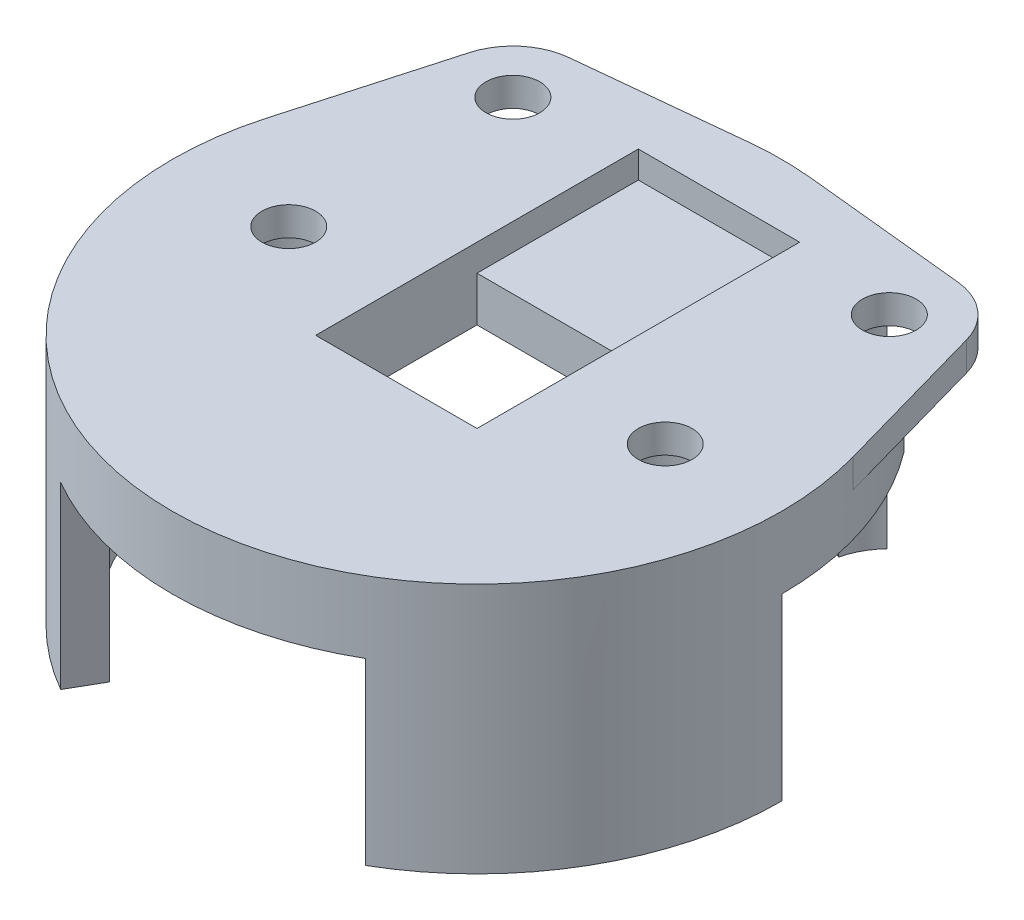
ISO-10303-21;
HEADER;
FILE_DESCRIPTION(('STEP AP214'),'2;1');
FILE_NAME('part.step','',(''),(''),'','','');
FILE_SCHEMA(('AUTOMOTIVE_DESIGN { 1 0 10303 214 1 1 1 1 }'));
ENDSEC;
DATA;
#1=APPLICATION_CONTEXT('core data for automotive mechanical design processes');
#2=APPLICATION_PROTOCOL_DEFINITION('international standard','automotive_design',2000,#1);
#3=PRODUCT_CONTEXT('',#1,'mechanical');
#4=PRODUCT('Part','Part','',(#3));
#5=PRODUCT_RELATED_PRODUCT_CATEGORY('part','',(#4));
#6=PRODUCT_DEFINITION_FORMATION('','',#4);
#7=PRODUCT_DEFINITION_CONTEXT('part definition',#1,'design');
#8=PRODUCT_DEFINITION('design','',#6,#7);
#9=PRODUCT_DEFINITION_SHAPE('','',#8);
#10=(LENGTH_UNIT() NAMED_UNIT(*) SI_UNIT(.MILLI.,.METRE.));
#11=(NAMED_UNIT(*) PLANE_ANGLE_UNIT() SI_UNIT($,.RADIAN.));
#12=(NAMED_UNIT(*) SI_UNIT($,.STERADIAN.) SOLID_ANGLE_UNIT());
#13=UNCERTAINTY_MEASURE_WITH_UNIT(LENGTH_MEASURE(1.E-05),#10,'distance_accuracy_value','');
#14=(GEOMETRIC_REPRESENTATION_CONTEXT(3) GLOBAL_UNCERTAINTY_ASSIGNED_CONTEXT((#13)) GLOBAL_UNIT_ASSIGNED_CONTEXT((#10,
#11,#12)) REPRESENTATION_CONTEXT('',''));
#15=CARTESIAN_POINT('',(0.,0.,0.));
#16=DIRECTION('',(0.,0.,1.));
#17=DIRECTION('',(1.,0.,0.));
#18=AXIS2_PLACEMENT_3D('',#15,#16,#17);
#19=CARTESIAN_POINT('',(0.,-10.,0.));
#20=DIRECTION('',(0.,1.,0.));
#21=DIRECTION('',(0.,0.,1.));
#22=AXIS2_PLACEMENT_3D('',#19,#20,#21);
#23=CYLINDRICAL_SURFACE('',#22,17.);
#24=CARTESIAN_POINT('',(0.,-10.,0.));
#25=DIRECTION('',(0.,1.,0.));
#26=DIRECTION('',(0.,0.,1.));
#27=AXIS2_PLACEMENT_3D('',#24,#25,#26);
#28=CIRCLE('',#27,17.);
#29=CARTESIAN_POINT('',(7.75524838483941,-10.,-15.1279913567349));
#30=VERTEX_POINT('',#29);
#31=CARTESIAN_POINT('',(-7.75524838483941,-10.,-15.1279913567349));
#32=VERTEX_POINT('',#31);
#33=EDGE_CURVE('E344',#30,#32,#28,.T.);
#34=ORIENTED_EDGE('',*,*,#33,.T.);
#35=DIRECTION('',(0.,1.,0.));
#36=VECTOR('',#35,1.);
#37=CARTESIAN_POINT('',(-7.75524838483941,-10.,-15.1279913567349));
#38=LINE('',#37,#36);
#39=CARTESIAN_POINT('',(-7.75524838483941,2.4,-15.1279913567349));
#40=VERTEX_POINT('',#39);
#41=EDGE_CURVE('E529',#32,#40,#38,.T.);
#42=ORIENTED_EDGE('',*,*,#41,.T.);
#43=CARTESIAN_POINT('',(0.,2.4,0.));
#44=DIRECTION('',(0.,-1.,0.));
#45=DIRECTION('',(0.,0.,-1.));
#46=AXIS2_PLACEMENT_3D('',#43,#44,#45);
#47=CIRCLE('',#46,17.);
#48=CARTESIAN_POINT('',(-1.72329934892919,2.4,-16.9124285468995));
#49=VERTEX_POINT('',#48);
#50=EDGE_CURVE('E513',#49,#40,#47,.F.);
#51=ORIENTED_EDGE('',*,*,#50,.F.);
#52=DIRECTION('',(0.,-1.,0.));
#53=VECTOR('',#52,1.);
#54=CARTESIAN_POINT('',(-1.7232993489292,4.,-16.9124285468995));
#55=LINE('',#54,#53);
#56=CARTESIAN_POINT('',(-1.7232993489292,4.,-16.9124285468995));
#57=VERTEX_POINT('',#56);
#58=EDGE_CURVE('E311',#57,#49,#55,.T.);
#59=ORIENTED_EDGE('',*,*,#58,.F.);
#60=CARTESIAN_POINT('',(0.,4.,0.));
#61=DIRECTION('',(0.,1.,0.));
#62=DIRECTION('',(0.,0.,1.));
#63=AXIS2_PLACEMENT_3D('',#60,#61,#62);
#64=CIRCLE('',#63,17.);
#65=CARTESIAN_POINT('',(1.7232993489292,4.,-16.9124285468995));
#66=VERTEX_POINT('',#65);
#67=EDGE_CURVE('E301',#66,#57,#64,.T.);
#68=ORIENTED_EDGE('',*,*,#67,.F.);
#69=DIRECTION('',(0.,-1.,0.));
#70=VECTOR('',#69,1.);
#71=CARTESIAN_POINT('',(1.7232993489292,4.,-16.9124285468995));
#72=LINE('',#71,#70);
#73=CARTESIAN_POINT('',(1.7232993489292,2.4,-16.9124285468995));
#74=VERTEX_POINT('',#73);
#75=EDGE_CURVE('E317',#66,#74,#72,.T.);
#76=ORIENTED_EDGE('',*,*,#75,.T.);
#77=CARTESIAN_POINT('',(0.,2.4,0.));
#78=DIRECTION('',(0.,-1.,0.));
#79=DIRECTION('',(0.,0.,-1.));
#80=AXIS2_PLACEMENT_3D('',#77,#78,#79);
#81=CIRCLE('',#80,17.);
#82=CARTESIAN_POINT('',(7.75524838483941,2.4,-15.1279913567349));
#83=VERTEX_POINT('',#82);
#84=EDGE_CURVE('E62',#83,#74,#81,.F.);
#85=ORIENTED_EDGE('',*,*,#84,.F.);
#86=DIRECTION('',(0.,1.,0.));
#87=VECTOR('',#86,1.);
#88=CARTESIAN_POINT('',(7.75524838483941,-10.,-15.1279913567349));
#89=LINE('',#88,#87);
#90=EDGE_CURVE('E397',#30,#83,#89,.T.);
#91=ORIENTED_EDGE('',*,*,#90,.F.);
#92=EDGE_LOOP('',(#34,#42,#51,#59,#68,#76,#85,#91));
#93=FACE_BOUND('',#92,.T.);
#94=ADVANCED_FACE('F39',(#93),#23,.T.);
#95=CARTESIAN_POINT('',(0.,-10.,0.));
#96=DIRECTION('',(0.,1.,0.));
#97=DIRECTION('',(0.,0.,1.));
#98=AXIS2_PLACEMENT_3D('',#95,#96,#97);
#99=PLANE('',#98);
#100=CARTESIAN_POINT('',(-10.5,-10.,-12.5));
#101=DIRECTION('',(0.,-1.,0.));
#102=DIRECTION('',(0.,0.,-1.));
#103=AXIS2_PLACEMENT_3D('',#100,#101,#102);
#104=CIRCLE('',#103,3.8);
#105=CARTESIAN_POINT('',(-6.80085727604426,-10.,-13.3696798881228));
#106=VERTEX_POINT('',#105);
#107=EDGE_CURVE('E523',#32,#106,#104,.T.);
#108=ORIENTED_EDGE('',*,*,#107,.F.);
#109=ORIENTED_EDGE('',*,*,#33,.F.);
#110=CARTESIAN_POINT('',(10.5,-10.,-12.5));
#111=DIRECTION('',(0.,-1.,0.));
#112=DIRECTION('',(0.,0.,-1.));
#113=AXIS2_PLACEMENT_3D('',#110,#111,#112);
#114=CIRCLE('',#113,3.8);
#115=CARTESIAN_POINT('',(6.80085727604426,-10.,-13.3696798881228));
#116=VERTEX_POINT('',#115);
#117=EDGE_CURVE('E384',#116,#30,#114,.T.);
#118=ORIENTED_EDGE('',*,*,#117,.F.);
#119=CARTESIAN_POINT('',(0.,-10.,0.));
#120=DIRECTION('',(0.,1.,0.));
#121=DIRECTION('',(0.,0.,1.));
#122=AXIS2_PLACEMENT_3D('',#119,#120,#121);
#123=CIRCLE('',#122,15.);
#124=EDGE_CURVE('E333',#116,#106,#123,.T.);
#125=ORIENTED_EDGE('',*,*,#124,.T.);
#126=EDGE_LOOP('',(#108,#109,#118,#125));
#127=FACE_BOUND('',#126,.T.);
#128=ADVANCED_FACE('F395',(#127),#99,.F.);
#129=CARTESIAN_POINT('',(0.,-10.,0.));
#130=DIRECTION('',(0.,1.,0.));
#131=DIRECTION('',(0.,0.,1.));
#132=AXIS2_PLACEMENT_3D('',#129,#130,#131);
#133=CYLINDRICAL_SURFACE('',#132,15.);
#134=DIRECTION('',(0.,1.,0.));
#135=VECTOR('',#134,1.);
#136=CARTESIAN_POINT('',(-6.80085727604426,-5.,-13.3696798881228));
#137=LINE('',#136,#135);
#138=CARTESIAN_POINT('',(-6.80085727604425,0.,-13.3696798881228));
#139=VERTEX_POINT('',#138);
#140=EDGE_CURVE('E402',#106,#139,#137,.T.);
#141=ORIENTED_EDGE('',*,*,#140,.F.);
#142=ORIENTED_EDGE('',*,*,#124,.F.);
#143=DIRECTION('',(0.,1.,0.));
#144=VECTOR('',#143,1.);
#145=CARTESIAN_POINT('',(6.80085727604426,-3.8,-13.3696798881228));
#146=LINE('',#145,#144);
#147=CARTESIAN_POINT('',(6.80085727604426,0.,-13.3696798881228));
#148=VERTEX_POINT('',#147);
#149=EDGE_CURVE('E47',#148,#116,#146,.F.);
#150=ORIENTED_EDGE('',*,*,#149,.F.);
#151=CARTESIAN_POINT('',(0.,0.,0.));
#152=DIRECTION('',(0.,1.,0.));
#153=DIRECTION('',(0.,0.,1.));
#154=AXIS2_PLACEMENT_3D('',#151,#152,#153);
#155=CIRCLE('',#154,15.);
#156=EDGE_CURVE('E335',#148,#139,#155,.T.);
#157=ORIENTED_EDGE('',*,*,#156,.T.);
#158=EDGE_LOOP('',(#141,#142,#150,#157));
#159=FACE_BOUND('',#158,.T.);
#160=ADVANCED_FACE('F401',(#159),#133,.F.);
#161=CARTESIAN_POINT('',(-10.5,4.,-12.5));
#162=DIRECTION('',(0.,-1.,0.));
#163=DIRECTION('',(0.,0.,-1.));
#164=AXIS2_PLACEMENT_3D('',#161,#162,#163);
#165=CYLINDRICAL_SURFACE('',#164,3.5);
#166=CARTESIAN_POINT('',(-10.5,2.4,-12.5));
#167=DIRECTION('',(0.,-1.,0.));
#168=DIRECTION('',(0.,0.,-1.));
#169=AXIS2_PLACEMENT_3D('',#166,#167,#168);
#170=CIRCLE('',#169,3.5);
#171=CARTESIAN_POINT('',(-13.8684676155582,2.4,-13.4504872029311));
#172=VERTEX_POINT('',#171);
#173=CARTESIAN_POINT('',(-10.8547969247795,2.4,-15.9819705831852));
#174=VERTEX_POINT('',#173);
#175=EDGE_CURVE('E54',#172,#174,#170,.T.);
#176=ORIENTED_EDGE('',*,*,#175,.F.);
#177=DIRECTION('',(0.,-1.,0.));
#178=VECTOR('',#177,1.);
#179=CARTESIAN_POINT('',(-13.8684676155582,4.,-13.4504872029311));
#180=LINE('',#179,#178);
#181=CARTESIAN_POINT('',(-13.8684676155582,4.,-13.4504872029311));
#182=VERTEX_POINT('',#181);
#183=EDGE_CURVE('E322',#182,#172,#180,.T.);
#184=ORIENTED_EDGE('',*,*,#183,.F.);
#185=CARTESIAN_POINT('',(-10.5,4.,-12.5));
#186=DIRECTION('',(0.,1.,0.));
#187=DIRECTION('',(0.,0.,1.));
#188=AXIS2_PLACEMENT_3D('',#185,#186,#187);
#189=CIRCLE('',#188,3.5);
#190=CARTESIAN_POINT('',(-10.8547969247795,4.,-15.9819705831852));
#191=VERTEX_POINT('',#190);
#192=EDGE_CURVE('E282',#191,#182,#189,.T.);
#193=ORIENTED_EDGE('',*,*,#192,.F.);
#194=DIRECTION('',(0.,-1.,0.));
#195=VECTOR('',#194,1.);
#196=CARTESIAN_POINT('',(-10.8547969247795,4.,-15.9819705831852));
#197=LINE('',#196,#195);
#198=EDGE_CURVE('E307',#191,#174,#197,.T.);
#199=ORIENTED_EDGE('',*,*,#198,.T.);
#200=EDGE_LOOP('',(#176,#184,#193,#199));
#201=FACE_BOUND('',#200,.T.);
#202=ADVANCED_FACE('F655',(#201),#165,.T.);
#203=CARTESIAN_POINT('',(-13.8684676155582,4.,-13.4504872029311));
#204=DIRECTION('',(0.962419318730906,0.,0.271567772266039));
#205=DIRECTION('',(0.271567772266039,0.,-0.962419318730906));
#206=AXIS2_PLACEMENT_3D('',#203,#204,#205);
#207=PLANE('',#206);
#208=DIRECTION('',(0.271567772266039,0.,-0.962419318730906));
#209=VECTOR('',#208,1.);
#210=CARTESIAN_POINT('',(-6.76044855927394,2.4,-38.6408652827488));
#211=LINE('',#210,#209);
#212=CARTESIAN_POINT('',(-16.3611284184254,2.4,-4.61665212852268));
#213=VERTEX_POINT('',#212);
#214=EDGE_CURVE('E505',#213,#172,#211,.T.);
#215=ORIENTED_EDGE('',*,*,#214,.F.);
#216=DIRECTION('',(0.,-1.,0.));
#217=VECTOR('',#216,1.);
#218=CARTESIAN_POINT('',(-16.3611284184254,4.,-4.61665212852268));
#219=LINE('',#218,#217);
#220=CARTESIAN_POINT('',(-16.3611284184254,4.,-4.61665212852268));
#221=VERTEX_POINT('',#220);
#222=EDGE_CURVE('E327',#221,#213,#219,.T.);
#223=ORIENTED_EDGE('',*,*,#222,.F.);
#224=DIRECTION('',(-0.271567772266039,0.,0.962419318730906));
#225=VECTOR('',#224,1.);
#226=CARTESIAN_POINT('',(-13.8684676155582,4.,-13.4504872029311));
#227=LINE('',#226,#225);
#228=EDGE_CURVE('E286',#182,#221,#227,.T.);
#229=ORIENTED_EDGE('',*,*,#228,.F.);
#230=ORIENTED_EDGE('',*,*,#183,.T.);
#231=EDGE_LOOP('',(#215,#223,#229,#230));
#232=FACE_BOUND('',#231,.T.);
#233=ADVANCED_FACE('F653',(#232),#207,.F.);
#234=CARTESIAN_POINT('',(-10.8547969247795,4.,-15.9819705831852));
#235=DIRECTION('',(0.101370549937012,0.,0.99484873805291));
#236=DIRECTION('',(0.99484873805291,0.,-0.101370549937012));
#237=AXIS2_PLACEMENT_3D('',#234,#235,#236);
#238=PLANE('',#237);
#239=DIRECTION('',(0.99484873805291,0.,-0.101370549937012));
#240=VECTOR('',#239,1.);
#241=CARTESIAN_POINT('',(0.516944180657916,2.4,-17.1406991471432));
#242=LINE('',#241,#240);
#243=EDGE_CURVE('E510',#174,#49,#242,.T.);
#244=ORIENTED_EDGE('',*,*,#243,.F.);
#245=ORIENTED_EDGE('',*,*,#198,.F.);
#246=DIRECTION('',(-0.99484873805291,0.,0.101370549937012));
#247=VECTOR('',#246,1.);
#248=CARTESIAN_POINT('',(-10.8547969247795,4.,-15.9819705831852));
#249=LINE('',#248,#247);
#250=EDGE_CURVE('E304',#57,#191,#249,.T.);
#251=ORIENTED_EDGE('',*,*,#250,.F.);
#252=ORIENTED_EDGE('',*,*,#58,.T.);
#253=EDGE_LOOP('',(#244,#245,#251,#252));
#254=FACE_BOUND('',#253,.T.);
#255=ADVANCED_FACE('F629',(#254),#238,.F.);
#256=CARTESIAN_POINT('',(-10.5,4.,-12.5));
#257=DIRECTION('',(0.,-1.,0.));
#258=DIRECTION('',(0.,0.,-1.));
#259=AXIS2_PLACEMENT_3D('',#256,#257,#258);
#260=CYLINDRICAL_SURFACE('',#259,1.5);
#261=CARTESIAN_POINT('',(-10.5,4.,-12.5));
#262=DIRECTION('',(0.,1.,0.));
#263=DIRECTION('',(0.,0.,1.));
#264=AXIS2_PLACEMENT_3D('',#261,#262,#263);
#265=CIRCLE('',#264,1.5);
#266=CARTESIAN_POINT('',(-10.5,4.,-11.));
#267=VERTEX_POINT('',#266);
#268=EDGE_CURVE('E270',#267,#267,#265,.T.);
#269=ORIENTED_EDGE('',*,*,#268,.T.);
#270=EDGE_LOOP('',(#269));
#271=FACE_BOUND('',#270,.T.);
#272=CARTESIAN_POINT('',(-10.5,2.4,-12.5));
#273=DIRECTION('',(0.,-1.,0.));
#274=DIRECTION('',(0.,0.,-1.));
#275=AXIS2_PLACEMENT_3D('',#272,#273,#274);
#276=CIRCLE('',#275,1.5);
#277=CARTESIAN_POINT('',(-10.5,2.4,-14.));
#278=VERTEX_POINT('',#277);
#279=EDGE_CURVE('E520',#278,#278,#276,.F.);
#280=ORIENTED_EDGE('',*,*,#279,.F.);
#281=EDGE_LOOP('',(#280));
#282=FACE_BOUND('',#281,.T.);
#283=ADVANCED_FACE('F686',(#271,#282),#260,.F.);
#284=CARTESIAN_POINT('',(13.8684676155582,4.,-13.4504872029311));
#285=DIRECTION('',(-0.962419318730906,0.,0.271567772266039));
#286=DIRECTION('',(0.271567772266039,0.,0.962419318730906));
#287=AXIS2_PLACEMENT_3D('',#284,#285,#286);
#288=PLANE('',#287);
#289=DIRECTION('',(0.271567772266039,0.,0.962419318730906));
#290=VECTOR('',#289,1.);
#291=CARTESIAN_POINT('',(6.53577288771756,2.4,-39.4371019088786));
#292=LINE('',#291,#290);
#293=CARTESIAN_POINT('',(13.8684676155582,2.4,-13.4504872029311));
#294=VERTEX_POINT('',#293);
#295=CARTESIAN_POINT('',(16.3611284184254,2.4,-4.61665212852267));
#296=VERTEX_POINT('',#295);
#297=EDGE_CURVE('E547',#294,#296,#292,.T.);
#298=ORIENTED_EDGE('',*,*,#297,.F.);
#299=DIRECTION('',(0.,-1.,0.));
#300=VECTOR('',#299,1.);
#301=CARTESIAN_POINT('',(13.8684676155582,4.,-13.4504872029311));
#302=LINE('',#301,#300);
#303=CARTESIAN_POINT('',(13.8684676155582,4.,-13.4504872029311));
#304=VERTEX_POINT('',#303);
#305=EDGE_CURVE('E316',#304,#294,#302,.T.);
#306=ORIENTED_EDGE('',*,*,#305,.F.);
#307=DIRECTION('',(-0.271567772266039,0.,-0.962419318730906));
#308=VECTOR('',#307,1.);
#309=CARTESIAN_POINT('',(13.8684676155582,4.,-13.4504872029311));
#310=LINE('',#309,#308);
#311=CARTESIAN_POINT('',(16.3611284184254,4.,-4.61665212852267));
#312=VERTEX_POINT('',#311);
#313=EDGE_CURVE('E292',#312,#304,#310,.T.);
#314=ORIENTED_EDGE('',*,*,#313,.F.);
#315=DIRECTION('',(0.,-1.,0.));
#316=VECTOR('',#315,1.);
#317=CARTESIAN_POINT('',(16.3611284184254,4.,-4.61665212852267));
#318=LINE('',#317,#316);
#319=EDGE_CURVE('E321',#312,#296,#318,.T.);
#320=ORIENTED_EDGE('',*,*,#319,.T.);
#321=EDGE_LOOP('',(#298,#306,#314,#320));
#322=FACE_BOUND('',#321,.T.);
#323=ADVANCED_FACE('F703',(#322),#288,.F.);
#324=CARTESIAN_POINT('',(10.5,4.,-12.5));
#325=DIRECTION('',(0.,-1.,0.));
#326=DIRECTION('',(0.,0.,-1.));
#327=AXIS2_PLACEMENT_3D('',#324,#325,#326);
#328=CYLINDRICAL_SURFACE('',#327,3.5);
#329=CARTESIAN_POINT('',(10.5,2.4,-12.5));
#330=DIRECTION('',(0.,-1.,0.));
#331=DIRECTION('',(0.,0.,-1.));
#332=AXIS2_PLACEMENT_3D('',#329,#330,#331);
#333=CIRCLE('',#332,3.5);
#334=CARTESIAN_POINT('',(10.8547969247795,2.4,-15.9819705831852));
#335=VERTEX_POINT('',#334);
#336=EDGE_CURVE('E544',#335,#294,#333,.T.);
#337=ORIENTED_EDGE('',*,*,#336,.F.);
#338=DIRECTION('',(0.,-1.,0.));
#339=VECTOR('',#338,1.);
#340=CARTESIAN_POINT('',(10.8547969247795,4.,-15.9819705831852));
#341=LINE('',#340,#339);
#342=CARTESIAN_POINT('',(10.8547969247795,4.,-15.9819705831852));
#343=VERTEX_POINT('',#342);
#344=EDGE_CURVE('E312',#343,#335,#341,.T.);
#345=ORIENTED_EDGE('',*,*,#344,.F.);
#346=CARTESIAN_POINT('',(10.5,4.,-12.5));
#347=DIRECTION('',(0.,1.,0.));
#348=DIRECTION('',(0.,0.,1.));
#349=AXIS2_PLACEMENT_3D('',#346,#347,#348);
#350=CIRCLE('',#349,3.5);
#351=EDGE_CURVE('E295',#304,#343,#350,.T.);
#352=ORIENTED_EDGE('',*,*,#351,.F.);
#353=ORIENTED_EDGE('',*,*,#305,.T.);
#354=EDGE_LOOP('',(#337,#345,#352,#353));
#355=FACE_BOUND('',#354,.T.);
#356=ADVANCED_FACE('F700',(#355),#328,.T.);
#357=CARTESIAN_POINT('',(1.7232993489292,4.,-16.9124285468995));
#358=DIRECTION('',(-0.101370549937012,0.,0.99484873805291));
#359=DIRECTION('',(0.99484873805291,0.,0.101370549937012));
#360=AXIS2_PLACEMENT_3D('',#357,#358,#359);
#361=PLANE('',#360);
#362=DIRECTION('',(0.99484873805291,0.,0.101370549937012));
#363=VECTOR('',#362,1.);
#364=CARTESIAN_POINT('',(-3.53212731979536,2.4,-17.4479325599064));
#365=LINE('',#364,#363);
#366=EDGE_CURVE('E541',#74,#335,#365,.T.);
#367=ORIENTED_EDGE('',*,*,#366,.F.);
#368=ORIENTED_EDGE('',*,*,#75,.F.);
#369=DIRECTION('',(-0.99484873805291,0.,-0.101370549937012));
#370=VECTOR('',#369,1.);
#371=CARTESIAN_POINT('',(1.7232993489292,4.,-16.9124285468995));
#372=LINE('',#371,#370);
#373=EDGE_CURVE('E298',#343,#66,#372,.T.);
#374=ORIENTED_EDGE('',*,*,#373,.F.);
#375=ORIENTED_EDGE('',*,*,#344,.T.);
#376=EDGE_LOOP('',(#367,#368,#374,#375));
#377=FACE_BOUND('',#376,.T.);
#378=ADVANCED_FACE('F640',(#377),#361,.F.);
#379=CARTESIAN_POINT('',(10.5,4.,-12.5));
#380=DIRECTION('',(0.,-1.,0.));
#381=DIRECTION('',(0.,0.,-1.));
#382=AXIS2_PLACEMENT_3D('',#379,#380,#381);
#383=CYLINDRICAL_SURFACE('',#382,1.5);
#384=CARTESIAN_POINT('',(10.5,4.,-12.5));
#385=DIRECTION('',(0.,1.,0.));
#386=DIRECTION('',(0.,0.,1.));
#387=AXIS2_PLACEMENT_3D('',#384,#385,#386);
#388=CIRCLE('',#387,1.5);
#389=CARTESIAN_POINT('',(10.5,4.,-11.));
#390=VERTEX_POINT('',#389);
#391=EDGE_CURVE('E260',#390,#390,#388,.T.);
#392=ORIENTED_EDGE('',*,*,#391,.T.);
#393=EDGE_LOOP('',(#392));
#394=FACE_BOUND('',#393,.T.);
#395=CARTESIAN_POINT('',(10.5,2.4,-12.5));
#396=DIRECTION('',(0.,-1.,0.));
#397=DIRECTION('',(0.,0.,-1.));
#398=AXIS2_PLACEMENT_3D('',#395,#396,#397);
#399=CIRCLE('',#398,1.5);
#400=CARTESIAN_POINT('',(10.5,2.4,-14.));
#401=VERTEX_POINT('',#400);
#402=EDGE_CURVE('E398',#401,#401,#399,.F.);
#403=ORIENTED_EDGE('',*,*,#402,.F.);
#404=EDGE_LOOP('',(#403));
#405=FACE_BOUND('',#404,.T.);
#406=ADVANCED_FACE('F694',(#394,#405),#383,.F.);
#407=CARTESIAN_POINT('',(-10.5,0.,-12.5));
#408=DIRECTION('',(0.,1.,0.));
#409=DIRECTION('',(0.,0.,1.));
#410=AXIS2_PLACEMENT_3D('',#407,#408,#409);
#411=PLANE('',#410);
#412=CARTESIAN_POINT('',(10.5,0.,0.));
#413=DIRECTION('',(0.,1.,0.));
#414=DIRECTION('',(0.,0.,1.));
#415=AXIS2_PLACEMENT_3D('',#412,#413,#414);
#416=CIRCLE('',#415,3.45);
#417=CARTESIAN_POINT('',(10.5,0.,3.45));
#418=VERTEX_POINT('',#417);
#419=EDGE_CURVE('E365',#418,#418,#416,.F.);
#420=ORIENTED_EDGE('',*,*,#419,.F.);
#421=EDGE_LOOP('',(#420));
#422=FACE_BOUND('',#421,.T.);
#423=CARTESIAN_POINT('',(0.,0.,0.));
#424=DIRECTION('',(0.,-1.,0.));
#425=DIRECTION('',(0.,0.,-1.));
#426=AXIS2_PLACEMENT_3D('',#423,#424,#425);
#427=CIRCLE('',#426,17.);
#428=CARTESIAN_POINT('',(-17.,0.,0.));
#429=VERTEX_POINT('',#428);
#430=CARTESIAN_POINT('',(-13.5623125907704,0.,-10.2500574237529));
#431=VERTEX_POINT('',#430);
#432=EDGE_CURVE('E369',#429,#431,#427,.T.);
#433=ORIENTED_EDGE('',*,*,#432,.T.);
#434=CARTESIAN_POINT('',(-10.5,0.,-12.5));
#435=DIRECTION('',(0.,1.,0.));
#436=DIRECTION('',(0.,0.,1.));
#437=AXIS2_PLACEMENT_3D('',#434,#435,#436);
#438=CIRCLE('',#437,3.8);
#439=EDGE_CURVE('E12',#139,#431,#438,.F.);
#440=ORIENTED_EDGE('',*,*,#439,.F.);
#441=ORIENTED_EDGE('',*,*,#156,.F.);
#442=CARTESIAN_POINT('',(10.5,0.,-12.5));
#443=DIRECTION('',(0.,1.,0.));
#444=DIRECTION('',(0.,0.,1.));
#445=AXIS2_PLACEMENT_3D('',#442,#443,#444);
#446=CIRCLE('',#445,3.8);
#447=CARTESIAN_POINT('',(13.5623125907704,0.,-10.2500574237529));
#448=VERTEX_POINT('',#447);
#449=EDGE_CURVE('E388',#448,#148,#446,.F.);
#450=ORIENTED_EDGE('',*,*,#449,.F.);
#451=CARTESIAN_POINT('',(0.,0.,0.));
#452=DIRECTION('',(0.,-1.,0.));
#453=DIRECTION('',(0.,0.,-1.));
#454=AXIS2_PLACEMENT_3D('',#451,#452,#453);
#455=CIRCLE('',#454,17.);
#456=CARTESIAN_POINT('',(17.,0.,0.));
#457=VERTEX_POINT('',#456);
#458=EDGE_CURVE('E587',#448,#457,#455,.T.);
#459=ORIENTED_EDGE('',*,*,#458,.T.);
#460=DIRECTION('',(-1.,0.,0.));
#461=VECTOR('',#460,1.);
#462=CARTESIAN_POINT('',(15.,0.,0.));
#463=LINE('',#462,#461);
#464=CARTESIAN_POINT('',(15.,0.,0.));
#465=VERTEX_POINT('',#464);
#466=EDGE_CURVE('E590',#457,#465,#463,.T.);
#467=ORIENTED_EDGE('',*,*,#466,.T.);
#468=CARTESIAN_POINT('',(7.50000000000002,0.,12.9903810567666));
#469=VERTEX_POINT('',#468);
#470=EDGE_CURVE('E326',#469,#465,#155,.T.);
#471=ORIENTED_EDGE('',*,*,#470,.F.);
#472=DIRECTION('',(0.500000000000001,0.,0.866025403784438));
#473=VECTOR('',#472,1.);
#474=CARTESIAN_POINT('',(7.50000000000002,0.,12.9903810567666));
#475=LINE('',#474,#473);
#476=CARTESIAN_POINT('',(8.50000000000002,0.,14.7224318643354));
#477=VERTEX_POINT('',#476);
#478=EDGE_CURVE('E600',#469,#477,#475,.T.);
#479=ORIENTED_EDGE('',*,*,#478,.T.);
#480=CARTESIAN_POINT('',(0.,0.,0.));
#481=DIRECTION('',(0.,-1.,0.));
#482=DIRECTION('',(0.,0.,-1.));
#483=AXIS2_PLACEMENT_3D('',#480,#481,#482);
#484=CIRCLE('',#483,17.);
#485=CARTESIAN_POINT('',(-8.50000000000002,0.,14.7224318643354));
#486=VERTEX_POINT('',#485);
#487=EDGE_CURVE('E444',#477,#486,#484,.T.);
#488=ORIENTED_EDGE('',*,*,#487,.T.);
#489=DIRECTION('',(0.500000000000001,0.,-0.866025403784438));
#490=VECTOR('',#489,1.);
#491=CARTESIAN_POINT('',(-7.50000000000002,0.,12.9903810567666));
#492=LINE('',#491,#490);
#493=CARTESIAN_POINT('',(-7.50000000000002,0.,12.9903810567666));
#494=VERTEX_POINT('',#493);
#495=EDGE_CURVE('E436',#486,#494,#492,.T.);
#496=ORIENTED_EDGE('',*,*,#495,.T.);
#497=CARTESIAN_POINT('',(-15.,0.,0.));
#498=VERTEX_POINT('',#497);
#499=EDGE_CURVE('E339',#498,#494,#155,.T.);
#500=ORIENTED_EDGE('',*,*,#499,.F.);
#501=DIRECTION('',(-1.,0.,0.));
#502=VECTOR('',#501,1.);
#503=CARTESIAN_POINT('',(-15.,0.,0.));
#504=LINE('',#503,#502);
#505=EDGE_CURVE('E574',#498,#429,#504,.T.);
#506=ORIENTED_EDGE('',*,*,#505,.T.);
#507=EDGE_LOOP('',(#433,#440,#441,#450,#459,#467,#471,#479,#488,#496,#500,#506));
#508=FACE_BOUND('',#507,.T.);
#509=DIRECTION('',(0.,0.,-1.));
#510=VECTOR('',#509,1.);
#511=CARTESIAN_POINT('',(4.5,0.,4.5));
#512=LINE('',#511,#510);
#513=CARTESIAN_POINT('',(4.5,0.,4.5));
#514=VERTEX_POINT('',#513);
#515=CARTESIAN_POINT('',(4.5,0.,-4.5));
#516=VERTEX_POINT('',#515);
#517=EDGE_CURVE('E429',#514,#516,#512,.T.);
#518=ORIENTED_EDGE('',*,*,#517,.T.);
#519=DIRECTION('',(-1.,0.,0.));
#520=VECTOR('',#519,1.);
#521=CARTESIAN_POINT('',(-4.5,0.,-4.5));
#522=LINE('',#521,#520);
#523=CARTESIAN_POINT('',(-4.5,0.,-4.5));
#524=VERTEX_POINT('',#523);
#525=EDGE_CURVE('E466',#516,#524,#522,.T.);
#526=ORIENTED_EDGE('',*,*,#525,.T.);
#527=DIRECTION('',(0.,0.,1.));
#528=VECTOR('',#527,1.);
#529=CARTESIAN_POINT('',(-4.5,0.,4.5));
#530=LINE('',#529,#528);
#531=CARTESIAN_POINT('',(-4.5,0.,4.5));
#532=VERTEX_POINT('',#531);
#533=EDGE_CURVE('E252',#524,#532,#530,.T.);
#534=ORIENTED_EDGE('',*,*,#533,.T.);
#535=DIRECTION('',(1.,0.,0.));
#536=VECTOR('',#535,1.);
#537=CARTESIAN_POINT('',(-4.5,0.,4.5));
#538=LINE('',#537,#536);
#539=EDGE_CURVE('E456',#532,#514,#538,.T.);
#540=ORIENTED_EDGE('',*,*,#539,.T.);
#541=EDGE_LOOP('',(#518,#526,#534,#540));
#542=FACE_BOUND('',#541,.T.);
#543=CARTESIAN_POINT('',(-10.5,0.,0.));
#544=DIRECTION('',(0.,1.,0.));
#545=DIRECTION('',(0.,0.,1.));
#546=AXIS2_PLACEMENT_3D('',#543,#544,#545);
#547=CIRCLE('',#546,3.45);
#548=CARTESIAN_POINT('',(-10.5,0.,3.45));
#549=VERTEX_POINT('',#548);
#550=EDGE_CURVE('E371',#549,#549,#547,.F.);
#551=ORIENTED_EDGE('',*,*,#550,.F.);
#552=EDGE_LOOP('',(#551));
#553=FACE_BOUND('',#552,.T.);
#554=ADVANCED_FACE('F484',(#422,#508,#542,#553),#411,.F.);
#555=CARTESIAN_POINT('',(-10.5,4.,0.));
#556=DIRECTION('',(0.,-1.,0.));
#557=DIRECTION('',(0.,0.,-1.));
#558=AXIS2_PLACEMENT_3D('',#555,#556,#557);
#559=CYLINDRICAL_SURFACE('',#558,1.5);
#560=CARTESIAN_POINT('',(-10.5,4.,0.));
#561=DIRECTION('',(0.,1.,0.));
#562=DIRECTION('',(0.,0.,1.));
#563=AXIS2_PLACEMENT_3D('',#560,#561,#562);
#564=CIRCLE('',#563,1.5);
#565=CARTESIAN_POINT('',(-10.5,4.,1.5));
#566=VERTEX_POINT('',#565);
#567=EDGE_CURVE('E278',#566,#566,#564,.T.);
#568=ORIENTED_EDGE('',*,*,#567,.T.);
#569=EDGE_LOOP('',(#568));
#570=FACE_BOUND('',#569,.T.);
#571=CARTESIAN_POINT('',(-10.5,2.4,0.));
#572=DIRECTION('',(0.,-1.,0.));
#573=DIRECTION('',(0.,0.,-1.));
#574=AXIS2_PLACEMENT_3D('',#571,#572,#573);
#575=CIRCLE('',#574,1.5);
#576=CARTESIAN_POINT('',(-10.5,2.4,-1.5));
#577=VERTEX_POINT('',#576);
#578=EDGE_CURVE('E560',#577,#577,#575,.F.);
#579=ORIENTED_EDGE('',*,*,#578,.F.);
#580=EDGE_LOOP('',(#579));
#581=FACE_BOUND('',#580,.T.);
#582=ADVANCED_FACE('F676',(#570,#581),#559,.F.);
#583=CARTESIAN_POINT('',(10.5,4.,0.));
#584=DIRECTION('',(0.,-1.,0.));
#585=DIRECTION('',(0.,0.,-1.));
#586=AXIS2_PLACEMENT_3D('',#583,#584,#585);
#587=CYLINDRICAL_SURFACE('',#586,1.5);
#588=CARTESIAN_POINT('',(10.5,4.,0.));
#589=DIRECTION('',(0.,1.,0.));
#590=DIRECTION('',(0.,0.,1.));
#591=AXIS2_PLACEMENT_3D('',#588,#589,#590);
#592=CIRCLE('',#591,1.5);
#593=CARTESIAN_POINT('',(10.5,4.,1.5));
#594=VERTEX_POINT('',#593);
#595=EDGE_CURVE('E274',#594,#594,#592,.T.);
#596=ORIENTED_EDGE('',*,*,#595,.T.);
#597=EDGE_LOOP('',(#596));
#598=FACE_BOUND('',#597,.T.);
#599=CARTESIAN_POINT('',(10.5,2.4,0.));
#600=DIRECTION('',(0.,-1.,0.));
#601=DIRECTION('',(0.,0.,-1.));
#602=AXIS2_PLACEMENT_3D('',#599,#600,#601);
#603=CIRCLE('',#602,1.5);
#604=CARTESIAN_POINT('',(10.5,2.4,-1.5));
#605=VERTEX_POINT('',#604);
#606=EDGE_CURVE('E374',#605,#605,#603,.F.);
#607=ORIENTED_EDGE('',*,*,#606,.F.);
#608=EDGE_LOOP('',(#607));
#609=FACE_BOUND('',#608,.T.);
#610=ADVANCED_FACE('F671',(#598,#609),#587,.F.);
#611=ORIENTED_EDGE('',*,*,#432,.F.);
#612=DIRECTION('',(0.,1.,0.));
#613=VECTOR('',#612,1.);
#614=CARTESIAN_POINT('',(-17.,-10.001,0.));
#615=LINE('',#614,#613);
#616=CARTESIAN_POINT('',(-17.,-10.,0.));
#617=VERTEX_POINT('',#616);
#618=EDGE_CURVE('E613',#617,#429,#615,.T.);
#619=ORIENTED_EDGE('',*,*,#618,.F.);
#620=CARTESIAN_POINT('',(-8.50000000000002,-10.,14.7224318643354));
#621=VERTEX_POINT('',#620);
#622=EDGE_CURVE('E332',#617,#621,#28,.T.);
#623=ORIENTED_EDGE('',*,*,#622,.T.);
#624=DIRECTION('',(0.,1.,0.));
#625=VECTOR('',#624,1.);
#626=CARTESIAN_POINT('',(-8.50000000000002,-10.001,14.7224318643354));
#627=LINE('',#626,#625);
#628=EDGE_CURVE('E427',#621,#486,#627,.T.);
#629=ORIENTED_EDGE('',*,*,#628,.T.);
#630=ORIENTED_EDGE('',*,*,#487,.F.);
#631=DIRECTION('',(0.,1.,0.));
#632=VECTOR('',#631,1.);
#633=CARTESIAN_POINT('',(8.50000000000002,-10.001,14.7224318643354));
#634=LINE('',#633,#632);
#635=CARTESIAN_POINT('',(8.50000000000002,-10.,14.7224318643354));
#636=VERTEX_POINT('',#635);
#637=EDGE_CURVE('E441',#636,#477,#634,.T.);
#638=ORIENTED_EDGE('',*,*,#637,.F.);
#639=CARTESIAN_POINT('',(17.,-10.,0.));
#640=VERTEX_POINT('',#639);
#641=EDGE_CURVE('E340',#636,#640,#28,.T.);
#642=ORIENTED_EDGE('',*,*,#641,.T.);
#643=DIRECTION('',(0.,1.,0.));
#644=VECTOR('',#643,1.);
#645=CARTESIAN_POINT('',(17.,-10.001,0.));
#646=LINE('',#645,#644);
#647=EDGE_CURVE('E596',#640,#457,#646,.T.);
#648=ORIENTED_EDGE('',*,*,#647,.T.);
#649=ORIENTED_EDGE('',*,*,#458,.F.);
#650=DIRECTION('',(0.,1.,0.));
#651=VECTOR('',#650,1.);
#652=CARTESIAN_POINT('',(13.5623125907704,-10.,-10.2500574237529));
#653=LINE('',#652,#651);
#654=CARTESIAN_POINT('',(13.5623125907704,2.4,-10.2500574237529));
#655=VERTEX_POINT('',#654);
#656=EDGE_CURVE('E556',#448,#655,#653,.T.);
#657=ORIENTED_EDGE('',*,*,#656,.T.);
#658=CARTESIAN_POINT('',(0.,2.4,0.));
#659=DIRECTION('',(0.,-1.,0.));
#660=DIRECTION('',(0.,0.,-1.));
#661=AXIS2_PLACEMENT_3D('',#658,#659,#660);
#662=CIRCLE('',#661,17.);
#663=EDGE_CURVE('E533',#655,#296,#662,.T.);
#664=ORIENTED_EDGE('',*,*,#663,.T.);
#665=ORIENTED_EDGE('',*,*,#319,.F.);
#666=CARTESIAN_POINT('',(0.,4.,0.));
#667=DIRECTION('',(0.,1.,0.));
#668=DIRECTION('',(0.,0.,1.));
#669=AXIS2_PLACEMENT_3D('',#666,#667,#668);
#670=CIRCLE('',#669,17.);
#671=EDGE_CURVE('E289',#221,#312,#670,.T.);
#672=ORIENTED_EDGE('',*,*,#671,.F.);
#673=ORIENTED_EDGE('',*,*,#222,.T.);
#674=CARTESIAN_POINT('',(0.,2.4,0.));
#675=DIRECTION('',(0.,-1.,0.));
#676=DIRECTION('',(0.,0.,-1.));
#677=AXIS2_PLACEMENT_3D('',#674,#675,#676);
#678=CIRCLE('',#677,17.);
#679=CARTESIAN_POINT('',(-13.5623125907704,2.4,-10.2500574237529));
#680=VERTEX_POINT('',#679);
#681=EDGE_CURVE('E499',#213,#680,#678,.T.);
#682=ORIENTED_EDGE('',*,*,#681,.T.);
#683=DIRECTION('',(0.,1.,0.));
#684=VECTOR('',#683,1.);
#685=CARTESIAN_POINT('',(-13.5623125907704,-10.,-10.2500574237529));
#686=LINE('',#685,#684);
#687=EDGE_CURVE('E526',#431,#680,#686,.T.);
#688=ORIENTED_EDGE('',*,*,#687,.F.);
#689=EDGE_LOOP('',(#611,#619,#623,#629,#630,#638,#642,#648,#649,#657,#664,#665,#672,#673,#682,#688));
#690=FACE_BOUND('',#689,.T.);
#691=ADVANCED_FACE('F611',(#690),#23,.T.);
#692=DIRECTION('',(1.,0.,0.));
#693=VECTOR('',#692,1.);
#694=CARTESIAN_POINT('',(-15.,-10.,0.));
#695=LINE('',#694,#693);
#696=CARTESIAN_POINT('',(-15.,-10.,0.));
#697=VERTEX_POINT('',#696);
#698=EDGE_CURVE('E416',#617,#697,#695,.T.);
#699=ORIENTED_EDGE('',*,*,#698,.T.);
#700=CARTESIAN_POINT('',(-7.50000000000002,-10.,12.9903810567666));
#701=VERTEX_POINT('',#700);
#702=EDGE_CURVE('E334',#697,#701,#123,.T.);
#703=ORIENTED_EDGE('',*,*,#702,.T.);
#704=DIRECTION('',(-0.500000000000001,0.,0.866025403784438));
#705=VECTOR('',#704,1.);
#706=CARTESIAN_POINT('',(-7.50000000000002,-10.,12.9903810567666));
#707=LINE('',#706,#705);
#708=EDGE_CURVE('E415',#701,#621,#707,.T.);
#709=ORIENTED_EDGE('',*,*,#708,.T.);
#710=ORIENTED_EDGE('',*,*,#622,.F.);
#711=EDGE_LOOP('',(#699,#703,#709,#710));
#712=FACE_BOUND('',#711,.T.);
#713=ADVANCED_FACE('F413',(#712),#99,.F.);
#714=DIRECTION('',(0.,1.,0.));
#715=VECTOR('',#714,1.);
#716=CARTESIAN_POINT('',(-15.,-10.001,0.));
#717=LINE('',#716,#715);
#718=EDGE_CURVE('E580',#697,#498,#717,.T.);
#719=ORIENTED_EDGE('',*,*,#718,.T.);
#720=ORIENTED_EDGE('',*,*,#499,.T.);
#721=DIRECTION('',(0.,1.,0.));
#722=VECTOR('',#721,1.);
#723=CARTESIAN_POINT('',(-7.50000000000002,-10.001,12.9903810567666));
#724=LINE('',#723,#722);
#725=EDGE_CURVE('E425',#701,#494,#724,.T.);
#726=ORIENTED_EDGE('',*,*,#725,.F.);
#727=ORIENTED_EDGE('',*,*,#702,.F.);
#728=EDGE_LOOP('',(#719,#720,#726,#727));
#729=FACE_BOUND('',#728,.T.);
#730=ADVANCED_FACE('F432',(#729),#133,.F.);
#731=DIRECTION('',(1.,0.,0.));
#732=VECTOR('',#731,1.);
#733=CARTESIAN_POINT('',(15.,-10.,0.));
#734=LINE('',#733,#732);
#735=CARTESIAN_POINT('',(15.,-10.,0.));
#736=VERTEX_POINT('',#735);
#737=EDGE_CURVE('E583',#736,#640,#734,.T.);
#738=ORIENTED_EDGE('',*,*,#737,.T.);
#739=ORIENTED_EDGE('',*,*,#641,.F.);
#740=DIRECTION('',(-0.500000000000001,0.,-0.866025403784438));
#741=VECTOR('',#740,1.);
#742=CARTESIAN_POINT('',(7.50000000000002,-10.,12.9903810567666));
#743=LINE('',#742,#741);
#744=CARTESIAN_POINT('',(7.50000000000001,-10.,12.9903810567666));
#745=VERTEX_POINT('',#744);
#746=EDGE_CURVE('E597',#636,#745,#743,.T.);
#747=ORIENTED_EDGE('',*,*,#746,.T.);
#748=EDGE_CURVE('E328',#745,#736,#123,.T.);
#749=ORIENTED_EDGE('',*,*,#748,.T.);
#750=EDGE_LOOP('',(#738,#739,#747,#749));
#751=FACE_BOUND('',#750,.T.);
#752=ADVANCED_FACE('F669',(#751),#99,.F.);
#753=DIRECTION('',(0.,1.,0.));
#754=VECTOR('',#753,1.);
#755=CARTESIAN_POINT('',(15.,-10.001,0.));
#756=LINE('',#755,#754);
#757=EDGE_CURVE('E1096',#736,#465,#756,.T.);
#758=ORIENTED_EDGE('',*,*,#757,.F.);
#759=ORIENTED_EDGE('',*,*,#748,.F.);
#760=DIRECTION('',(0.,1.,0.));
#761=VECTOR('',#760,1.);
#762=CARTESIAN_POINT('',(7.50000000000002,-10.001,12.9903810567666));
#763=LINE('',#762,#761);
#764=EDGE_CURVE('E430',#745,#469,#763,.T.);
#765=ORIENTED_EDGE('',*,*,#764,.T.);
#766=ORIENTED_EDGE('',*,*,#470,.T.);
#767=EDGE_LOOP('',(#758,#759,#765,#766));
#768=FACE_BOUND('',#767,.T.);
#769=ADVANCED_FACE('F664',(#768),#133,.F.);
#770=CARTESIAN_POINT('',(-10.5,4.,-12.5));
#771=DIRECTION('',(0.,1.,0.));
#772=DIRECTION('',(0.,0.,1.));
#773=AXIS2_PLACEMENT_3D('',#770,#771,#772);
#774=PLANE('',#773);
#775=DIRECTION('',(0.,0.,1.));
#776=VECTOR('',#775,1.);
#777=CARTESIAN_POINT('',(-4.5,4.,4.5));
#778=LINE('',#777,#776);
#779=CARTESIAN_POINT('',(-4.5,4.,-13.5));
#780=VERTEX_POINT('',#779);
#781=CARTESIAN_POINT('',(-4.5,4.,4.5));
#782=VERTEX_POINT('',#781);
#783=EDGE_CURVE('E455',#780,#782,#778,.T.);
#784=ORIENTED_EDGE('',*,*,#783,.F.);
#785=DIRECTION('',(-1.,0.,0.));
#786=VECTOR('',#785,1.);
#787=CARTESIAN_POINT('',(-4.5,4.,-13.5));
#788=LINE('',#787,#786);
#789=CARTESIAN_POINT('',(4.5,4.,-13.5));
#790=VERTEX_POINT('',#789);
#791=EDGE_CURVE('E239',#790,#780,#788,.T.);
#792=ORIENTED_EDGE('',*,*,#791,.F.);
#793=DIRECTION('',(0.,0.,-1.));
#794=VECTOR('',#793,1.);
#795=CARTESIAN_POINT('',(4.5,4.,4.5));
#796=LINE('',#795,#794);
#797=CARTESIAN_POINT('',(4.5,4.,4.5));
#798=VERTEX_POINT('',#797);
#799=EDGE_CURVE('E453',#798,#790,#796,.T.);
#800=ORIENTED_EDGE('',*,*,#799,.F.);
#801=DIRECTION('',(1.,0.,0.));
#802=VECTOR('',#801,1.);
#803=CARTESIAN_POINT('',(-4.5,4.,4.5));
#804=LINE('',#803,#802);
#805=EDGE_CURVE('E460',#782,#798,#804,.T.);
#806=ORIENTED_EDGE('',*,*,#805,.F.);
#807=EDGE_LOOP('',(#784,#792,#800,#806));
#808=FACE_BOUND('',#807,.T.);
#809=ORIENTED_EDGE('',*,*,#391,.F.);
#810=EDGE_LOOP('',(#809));
#811=FACE_BOUND('',#810,.T.);
#812=ORIENTED_EDGE('',*,*,#595,.F.);
#813=EDGE_LOOP('',(#812));
#814=FACE_BOUND('',#813,.T.);
#815=ORIENTED_EDGE('',*,*,#192,.T.);
#816=ORIENTED_EDGE('',*,*,#228,.T.);
#817=ORIENTED_EDGE('',*,*,#671,.T.);
#818=ORIENTED_EDGE('',*,*,#313,.T.);
#819=ORIENTED_EDGE('',*,*,#351,.T.);
#820=ORIENTED_EDGE('',*,*,#373,.T.);
#821=ORIENTED_EDGE('',*,*,#67,.T.);
#822=ORIENTED_EDGE('',*,*,#250,.T.);
#823=EDGE_LOOP('',(#815,#816,#817,#818,#819,#820,#821,#822));
#824=FACE_BOUND('',#823,.T.);
#825=ORIENTED_EDGE('',*,*,#567,.F.);
#826=EDGE_LOOP('',(#825));
#827=FACE_BOUND('',#826,.T.);
#828=ORIENTED_EDGE('',*,*,#268,.F.);
#829=EDGE_LOOP('',(#828));
#830=FACE_BOUND('',#829,.T.);
#831=ADVANCED_FACE('F632',(#808,#811,#814,#824,#827,#830),#774,.T.);
#832=CARTESIAN_POINT('',(4.5,4.,4.5));
#833=DIRECTION('',(-1.,0.,0.));
#834=DIRECTION('',(0.,0.,1.));
#835=AXIS2_PLACEMENT_3D('',#832,#833,#834);
#836=PLANE('',#835);
#837=ORIENTED_EDGE('',*,*,#517,.F.);
#838=DIRECTION('',(0.,-1.,0.));
#839=VECTOR('',#838,1.);
#840=CARTESIAN_POINT('',(4.5,4.,4.5));
#841=LINE('',#840,#839);
#842=EDGE_CURVE('E263',#798,#514,#841,.T.);
#843=ORIENTED_EDGE('',*,*,#842,.F.);
#844=ORIENTED_EDGE('',*,*,#799,.T.);
#845=DIRECTION('',(0.,1.,0.));
#846=VECTOR('',#845,1.);
#847=CARTESIAN_POINT('',(4.5,2.5,-13.5));
#848=LINE('',#847,#846);
#849=CARTESIAN_POINT('',(4.5,2.5,-13.5));
#850=VERTEX_POINT('',#849);
#851=EDGE_CURVE('E488',#850,#790,#848,.T.);
#852=ORIENTED_EDGE('',*,*,#851,.F.);
#853=DIRECTION('',(0.,0.,-1.));
#854=VECTOR('',#853,1.);
#855=CARTESIAN_POINT('',(4.5,2.5,-4.5));
#856=LINE('',#855,#854);
#857=CARTESIAN_POINT('',(4.5,2.5,-4.5));
#858=VERTEX_POINT('',#857);
#859=EDGE_CURVE('E248',#858,#850,#856,.T.);
#860=ORIENTED_EDGE('',*,*,#859,.F.);
#861=DIRECTION('',(0.,-1.,0.));
#862=VECTOR('',#861,1.);
#863=CARTESIAN_POINT('',(4.5,4.,-4.5));
#864=LINE('',#863,#862);
#865=EDGE_CURVE('E246',#858,#516,#864,.T.);
#866=ORIENTED_EDGE('',*,*,#865,.T.);
#867=EDGE_LOOP('',(#837,#843,#844,#852,#860,#866));
#868=FACE_BOUND('',#867,.T.);
#869=ADVANCED_FACE('F486',(#868),#836,.T.);
#870=CARTESIAN_POINT('',(-4.5,4.,-4.5));
#871=DIRECTION('',(0.,0.,1.));
#872=DIRECTION('',(1.,0.,0.));
#873=AXIS2_PLACEMENT_3D('',#870,#871,#872);
#874=PLANE('',#873);
#875=DIRECTION('',(1.,0.,0.));
#876=VECTOR('',#875,1.);
#877=CARTESIAN_POINT('',(-4.5,2.5,-4.5));
#878=LINE('',#877,#876);
#879=CARTESIAN_POINT('',(-4.5,2.5,-4.5));
#880=VERTEX_POINT('',#879);
#881=EDGE_CURVE('E231',#880,#858,#878,.T.);
#882=ORIENTED_EDGE('',*,*,#881,.F.);
#883=DIRECTION('',(0.,-1.,0.));
#884=VECTOR('',#883,1.);
#885=CARTESIAN_POINT('',(-4.5,4.,-4.5));
#886=LINE('',#885,#884);
#887=EDGE_CURVE('E244',#880,#524,#886,.T.);
#888=ORIENTED_EDGE('',*,*,#887,.T.);
#889=ORIENTED_EDGE('',*,*,#525,.F.);
#890=ORIENTED_EDGE('',*,*,#865,.F.);
#891=EDGE_LOOP('',(#882,#888,#889,#890));
#892=FACE_BOUND('',#891,.T.);
#893=ADVANCED_FACE('F242',(#892),#874,.T.);
#894=CARTESIAN_POINT('',(-4.5,4.,4.5));
#895=DIRECTION('',(1.,0.,0.));
#896=DIRECTION('',(0.,0.,-1.));
#897=AXIS2_PLACEMENT_3D('',#894,#895,#896);
#898=PLANE('',#897);
#899=ORIENTED_EDGE('',*,*,#533,.F.);
#900=ORIENTED_EDGE('',*,*,#887,.F.);
#901=DIRECTION('',(0.,0.,1.));
#902=VECTOR('',#901,1.);
#903=CARTESIAN_POINT('',(-4.5,2.5,-4.5));
#904=LINE('',#903,#902);
#905=CARTESIAN_POINT('',(-4.5,2.5,-13.5));
#906=VERTEX_POINT('',#905);
#907=EDGE_CURVE('E227',#906,#880,#904,.T.);
#908=ORIENTED_EDGE('',*,*,#907,.F.);
#909=DIRECTION('',(0.,1.,0.));
#910=VECTOR('',#909,1.);
#911=CARTESIAN_POINT('',(-4.5,2.5,-13.5));
#912=LINE('',#911,#910);
#913=EDGE_CURVE('E497',#906,#780,#912,.T.);
#914=ORIENTED_EDGE('',*,*,#913,.T.);
#915=ORIENTED_EDGE('',*,*,#783,.T.);
#916=DIRECTION('',(0.,-1.,0.));
#917=VECTOR('',#916,1.);
#918=CARTESIAN_POINT('',(-4.5,4.,4.5));
#919=LINE('',#918,#917);
#920=EDGE_CURVE('E255',#782,#532,#919,.T.);
#921=ORIENTED_EDGE('',*,*,#920,.T.);
#922=EDGE_LOOP('',(#899,#900,#908,#914,#915,#921));
#923=FACE_BOUND('',#922,.T.);
#924=ADVANCED_FACE('F250',(#923),#898,.T.);
#925=CARTESIAN_POINT('',(-4.5,4.,4.5));
#926=DIRECTION('',(0.,0.,-1.));
#927=DIRECTION('',(-1.,0.,0.));
#928=AXIS2_PLACEMENT_3D('',#925,#926,#927);
#929=PLANE('',#928);
#930=ORIENTED_EDGE('',*,*,#539,.F.);
#931=ORIENTED_EDGE('',*,*,#920,.F.);
#932=ORIENTED_EDGE('',*,*,#805,.T.);
#933=ORIENTED_EDGE('',*,*,#842,.T.);
#934=EDGE_LOOP('',(#930,#931,#932,#933));
#935=FACE_BOUND('',#934,.T.);
#936=ADVANCED_FACE('F479',(#935),#929,.T.);
#937=CARTESIAN_POINT('',(7.50000000000002,-10.001,12.9903810567666));
#938=DIRECTION('',(-0.866025403784438,0.,0.500000000000001));
#939=DIRECTION('',(0.500000000000001,0.,0.866025403784438));
#940=AXIS2_PLACEMENT_3D('',#937,#938,#939);
#941=PLANE('',#940);
#942=ORIENTED_EDGE('',*,*,#637,.T.);
#943=ORIENTED_EDGE('',*,*,#478,.F.);
#944=ORIENTED_EDGE('',*,*,#764,.F.);
#945=ORIENTED_EDGE('',*,*,#746,.F.);
#946=EDGE_LOOP('',(#942,#943,#944,#945));
#947=FACE_BOUND('',#946,.T.);
#948=ADVANCED_FACE('F762',(#947),#941,.T.);
#949=CARTESIAN_POINT('',(-7.50000000000002,-10.001,12.9903810567666));
#950=DIRECTION('',(0.866025403784438,0.,0.500000000000001));
#951=DIRECTION('',(0.500000000000001,0.,-0.866025403784438));
#952=AXIS2_PLACEMENT_3D('',#949,#950,#951);
#953=PLANE('',#952);
#954=ORIENTED_EDGE('',*,*,#725,.T.);
#955=ORIENTED_EDGE('',*,*,#495,.F.);
#956=ORIENTED_EDGE('',*,*,#628,.F.);
#957=ORIENTED_EDGE('',*,*,#708,.F.);
#958=EDGE_LOOP('',(#954,#955,#956,#957));
#959=FACE_BOUND('',#958,.T.);
#960=ADVANCED_FACE('F423',(#959),#953,.T.);
#961=CARTESIAN_POINT('',(15.,-10.001,0.));
#962=DIRECTION('',(0.,0.,-1.));
#963=DIRECTION('',(-1.,0.,0.));
#964=AXIS2_PLACEMENT_3D('',#961,#962,#963);
#965=PLANE('',#964);
#966=ORIENTED_EDGE('',*,*,#757,.T.);
#967=ORIENTED_EDGE('',*,*,#466,.F.);
#968=ORIENTED_EDGE('',*,*,#647,.F.);
#969=ORIENTED_EDGE('',*,*,#737,.F.);
#970=EDGE_LOOP('',(#966,#967,#968,#969));
#971=FACE_BOUND('',#970,.T.);
#972=ADVANCED_FACE('F755',(#971),#965,.T.);
#973=CARTESIAN_POINT('',(-15.,-10.001,0.));
#974=DIRECTION('',(0.,0.,-1.));
#975=DIRECTION('',(-1.,0.,0.));
#976=AXIS2_PLACEMENT_3D('',#973,#974,#975);
#977=PLANE('',#976);
#978=ORIENTED_EDGE('',*,*,#618,.T.);
#979=ORIENTED_EDGE('',*,*,#505,.F.);
#980=ORIENTED_EDGE('',*,*,#718,.F.);
#981=ORIENTED_EDGE('',*,*,#698,.F.);
#982=EDGE_LOOP('',(#978,#979,#980,#981));
#983=FACE_BOUND('',#982,.T.);
#984=ADVANCED_FACE('F751',(#983),#977,.T.);
#985=CARTESIAN_POINT('',(10.5,-10.,0.));
#986=DIRECTION('',(0.,1.,0.));
#987=DIRECTION('',(0.,0.,1.));
#988=AXIS2_PLACEMENT_3D('',#985,#986,#987);
#989=CYLINDRICAL_SURFACE('',#988,3.45);
#990=CARTESIAN_POINT('',(10.5,2.4,0.));
#991=DIRECTION('',(0.,-1.,0.));
#992=DIRECTION('',(0.,0.,-1.));
#993=AXIS2_PLACEMENT_3D('',#990,#991,#992);
#994=CIRCLE('',#993,3.45);
#995=CARTESIAN_POINT('',(10.5,2.4,-3.45));
#996=VERTEX_POINT('',#995);
#997=EDGE_CURVE('E370',#996,#996,#994,.T.);
#998=ORIENTED_EDGE('',*,*,#997,.F.);
#999=EDGE_LOOP('',(#998));
#1000=FACE_BOUND('',#999,.T.);
#1001=ORIENTED_EDGE('',*,*,#419,.T.);
#1002=EDGE_LOOP('',(#1001));
#1003=FACE_BOUND('',#1002,.T.);
#1004=ADVANCED_FACE('F747',(#1000,#1003),#989,.F.);
#1005=CARTESIAN_POINT('',(-1.52324441146295,2.4,-37.1630729778324));
#1006=DIRECTION('',(0.,-1.,0.));
#1007=DIRECTION('',(0.,0.,-1.));
#1008=AXIS2_PLACEMENT_3D('',#1005,#1006,#1007);
#1009=PLANE('',#1008);
#1010=ORIENTED_EDGE('',*,*,#606,.T.);
#1011=EDGE_LOOP('',(#1010));
#1012=FACE_BOUND('',#1011,.T.);
#1013=ORIENTED_EDGE('',*,*,#997,.T.);
#1014=EDGE_LOOP('',(#1013));
#1015=FACE_BOUND('',#1014,.T.);
#1016=ADVANCED_FACE('F743',(#1012,#1015),#1009,.T.);
#1017=CARTESIAN_POINT('',(-10.5,-10.,0.));
#1018=DIRECTION('',(0.,1.,0.));
#1019=DIRECTION('',(0.,0.,1.));
#1020=AXIS2_PLACEMENT_3D('',#1017,#1018,#1019);
#1021=CYLINDRICAL_SURFACE('',#1020,3.45);
#1022=CARTESIAN_POINT('',(-10.5,2.4,0.));
#1023=DIRECTION('',(0.,-1.,0.));
#1024=DIRECTION('',(0.,0.,-1.));
#1025=AXIS2_PLACEMENT_3D('',#1022,#1023,#1024);
#1026=CIRCLE('',#1025,3.45);
#1027=CARTESIAN_POINT('',(-10.5,2.4,-3.45));
#1028=VERTEX_POINT('',#1027);
#1029=EDGE_CURVE('E375',#1028,#1028,#1026,.T.);
#1030=ORIENTED_EDGE('',*,*,#1029,.F.);
#1031=EDGE_LOOP('',(#1030));
#1032=FACE_BOUND('',#1031,.T.);
#1033=ORIENTED_EDGE('',*,*,#550,.T.);
#1034=EDGE_LOOP('',(#1033));
#1035=FACE_BOUND('',#1034,.T.);
#1036=ADVANCED_FACE('F739',(#1032,#1035),#1021,.F.);
#1037=CARTESIAN_POINT('',(-1.52324441146295,2.4,-37.1630729778324));
#1038=DIRECTION('',(0.,-1.,0.));
#1039=DIRECTION('',(0.,0.,-1.));
#1040=AXIS2_PLACEMENT_3D('',#1037,#1038,#1039);
#1041=PLANE('',#1040);
#1042=ORIENTED_EDGE('',*,*,#578,.T.);
#1043=EDGE_LOOP('',(#1042));
#1044=FACE_BOUND('',#1043,.T.);
#1045=ORIENTED_EDGE('',*,*,#1029,.T.);
#1046=EDGE_LOOP('',(#1045));
#1047=FACE_BOUND('',#1046,.T.);
#1048=ADVANCED_FACE('F736',(#1044,#1047),#1041,.T.);
#1049=CARTESIAN_POINT('',(10.5,-10.,-12.5));
#1050=DIRECTION('',(0.,1.,0.));
#1051=DIRECTION('',(0.,0.,1.));
#1052=AXIS2_PLACEMENT_3D('',#1049,#1050,#1051);
#1053=CYLINDRICAL_SURFACE('',#1052,3.8);
#1054=ORIENTED_EDGE('',*,*,#449,.T.);
#1055=ORIENTED_EDGE('',*,*,#149,.T.);
#1056=ORIENTED_EDGE('',*,*,#117,.T.);
#1057=ORIENTED_EDGE('',*,*,#90,.T.);
#1058=CARTESIAN_POINT('',(10.5,2.4,-12.5));
#1059=DIRECTION('',(0.,-1.,0.));
#1060=DIRECTION('',(0.,0.,-1.));
#1061=AXIS2_PLACEMENT_3D('',#1058,#1059,#1060);
#1062=CIRCLE('',#1061,3.8);
#1063=EDGE_CURVE('E536',#655,#83,#1062,.T.);
#1064=ORIENTED_EDGE('',*,*,#1063,.F.);
#1065=ORIENTED_EDGE('',*,*,#656,.F.);
#1066=EDGE_LOOP('',(#1054,#1055,#1056,#1057,#1064,#1065));
#1067=FACE_BOUND('',#1066,.T.);
#1068=ADVANCED_FACE('F383',(#1067),#1053,.F.);
#1069=CARTESIAN_POINT('',(-1.52324441146295,2.4,-37.1630729778324));
#1070=DIRECTION('',(0.,-1.,0.));
#1071=DIRECTION('',(0.,0.,-1.));
#1072=AXIS2_PLACEMENT_3D('',#1069,#1070,#1071);
#1073=PLANE('',#1072);
#1074=ORIENTED_EDGE('',*,*,#663,.F.);
#1075=ORIENTED_EDGE('',*,*,#1063,.T.);
#1076=ORIENTED_EDGE('',*,*,#84,.T.);
#1077=ORIENTED_EDGE('',*,*,#366,.T.);
#1078=ORIENTED_EDGE('',*,*,#336,.T.);
#1079=ORIENTED_EDGE('',*,*,#297,.T.);
#1080=EDGE_LOOP('',(#1074,#1075,#1076,#1077,#1078,#1079));
#1081=FACE_BOUND('',#1080,.T.);
#1082=ORIENTED_EDGE('',*,*,#402,.T.);
#1083=EDGE_LOOP('',(#1082));
#1084=FACE_BOUND('',#1083,.T.);
#1085=ADVANCED_FACE('F643',(#1081,#1084),#1073,.T.);
#1086=CARTESIAN_POINT('',(-10.5,-10.,-12.5));
#1087=DIRECTION('',(0.,1.,0.));
#1088=DIRECTION('',(0.,0.,1.));
#1089=AXIS2_PLACEMENT_3D('',#1086,#1087,#1088);
#1090=CYLINDRICAL_SURFACE('',#1089,3.8);
#1091=ORIENTED_EDGE('',*,*,#140,.T.);
#1092=ORIENTED_EDGE('',*,*,#439,.T.);
#1093=ORIENTED_EDGE('',*,*,#687,.T.);
#1094=CARTESIAN_POINT('',(-10.5,2.4,-12.5));
#1095=DIRECTION('',(0.,-1.,0.));
#1096=DIRECTION('',(0.,0.,-1.));
#1097=AXIS2_PLACEMENT_3D('',#1094,#1095,#1096);
#1098=CIRCLE('',#1097,3.8);
#1099=EDGE_CURVE('E516',#40,#680,#1098,.T.);
#1100=ORIENTED_EDGE('',*,*,#1099,.F.);
#1101=ORIENTED_EDGE('',*,*,#41,.F.);
#1102=ORIENTED_EDGE('',*,*,#107,.T.);
#1103=EDGE_LOOP('',(#1091,#1092,#1093,#1100,#1101,#1102));
#1104=FACE_BOUND('',#1103,.T.);
#1105=ADVANCED_FACE('F619',(#1104),#1090,.F.);
#1106=CARTESIAN_POINT('',(-1.52324441146295,2.4,-37.1630729778324));
#1107=DIRECTION('',(0.,-1.,0.));
#1108=DIRECTION('',(0.,0.,-1.));
#1109=AXIS2_PLACEMENT_3D('',#1106,#1107,#1108);
#1110=PLANE('',#1109);
#1111=ORIENTED_EDGE('',*,*,#681,.F.);
#1112=ORIENTED_EDGE('',*,*,#214,.T.);
#1113=ORIENTED_EDGE('',*,*,#175,.T.);
#1114=ORIENTED_EDGE('',*,*,#243,.T.);
#1115=ORIENTED_EDGE('',*,*,#50,.T.);
#1116=ORIENTED_EDGE('',*,*,#1099,.T.);
#1117=EDGE_LOOP('',(#1111,#1112,#1113,#1114,#1115,#1116));
#1118=FACE_BOUND('',#1117,.T.);
#1119=ORIENTED_EDGE('',*,*,#279,.T.);
#1120=EDGE_LOOP('',(#1119));
#1121=FACE_BOUND('',#1120,.T.);
#1122=ADVANCED_FACE('F621',(#1118,#1121),#1110,.T.);
#1123=CARTESIAN_POINT('',(-4.5,2.5,-13.5));
#1124=DIRECTION('',(0.,0.,-1.));
#1125=DIRECTION('',(-1.,0.,0.));
#1126=AXIS2_PLACEMENT_3D('',#1123,#1124,#1125);
#1127=PLANE('',#1126);
#1128=ORIENTED_EDGE('',*,*,#791,.T.);
#1129=ORIENTED_EDGE('',*,*,#913,.F.);
#1130=DIRECTION('',(-1.,0.,0.));
#1131=VECTOR('',#1130,1.);
#1132=CARTESIAN_POINT('',(-4.5,2.5,-13.5));
#1133=LINE('',#1132,#1131);
#1134=EDGE_CURVE('E234',#850,#906,#1133,.T.);
#1135=ORIENTED_EDGE('',*,*,#1134,.F.);
#1136=ORIENTED_EDGE('',*,*,#851,.T.);
#1137=EDGE_LOOP('',(#1128,#1129,#1135,#1136));
#1138=FACE_BOUND('',#1137,.T.);
#1139=ADVANCED_FACE('F721',(#1138),#1127,.F.);
#1140=CARTESIAN_POINT('',(-4.5,2.5,-13.5));
#1141=DIRECTION('',(0.,-1.,0.));
#1142=DIRECTION('',(0.,0.,-1.));
#1143=AXIS2_PLACEMENT_3D('',#1140,#1141,#1142);
#1144=PLANE('',#1143);
#1145=ORIENTED_EDGE('',*,*,#907,.T.);
#1146=ORIENTED_EDGE('',*,*,#881,.T.);
#1147=ORIENTED_EDGE('',*,*,#859,.T.);
#1148=ORIENTED_EDGE('',*,*,#1134,.T.);
#1149=EDGE_LOOP('',(#1145,#1146,#1147,#1148));
#1150=FACE_BOUND('',#1149,.T.);
#1151=ADVANCED_FACE('F229',(#1150),#1144,.F.);
#1152=CLOSED_SHELL('',(#94,#128,#160,#202,#233,#255,#283,#323,#356,#378,#406,#554,#582,#610,
#691,#713,#730,#752,#769,#831,#869,#893,#924,#936,#948,#960,#972,#984,#1004,#1016,#1036,#1048,
#1068,#1085,#1105,#1122,#1139,#1151));
#1153=MANIFOLD_SOLID_BREP('B2',#1152);
#1154=ADVANCED_BREP_SHAPE_REPRESENTATION('',(#18,#1153),#14);
#1155=SHAPE_DEFINITION_REPRESENTATION(#9,#1154);
ENDSEC;
END-ISO-10303-21;
